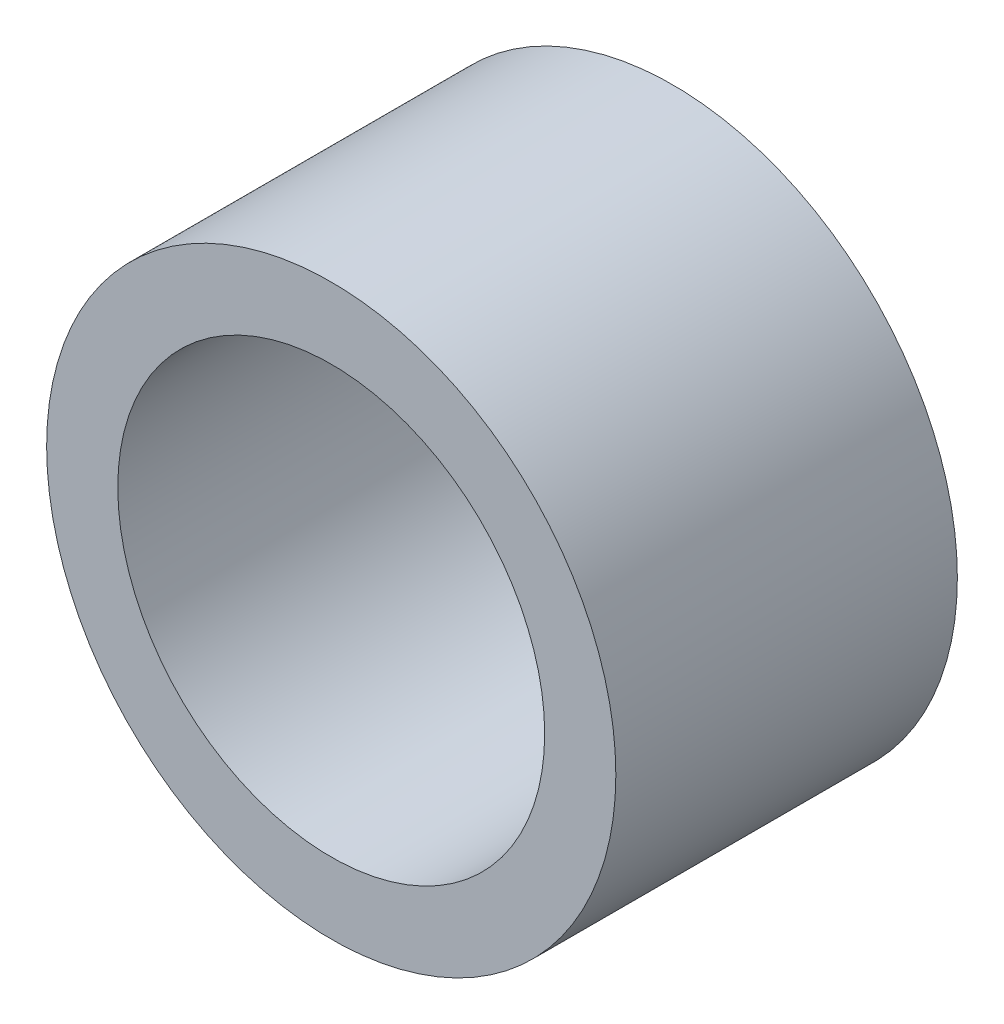
ISO-10303-21;
HEADER;
FILE_DESCRIPTION(('STEP AP214'),'2;1');
FILE_NAME('part.step','',(''),(''),'','','');
FILE_SCHEMA(('AUTOMOTIVE_DESIGN { 1 0 10303 214 1 1 1 1 }'));
ENDSEC;
DATA;
#1=APPLICATION_CONTEXT('core data for automotive mechanical design processes');
#2=APPLICATION_PROTOCOL_DEFINITION('international standard','automotive_design',2000,#1);
#3=PRODUCT_CONTEXT('',#1,'mechanical');
#4=PRODUCT('Part','Part','',(#3));
#5=PRODUCT_RELATED_PRODUCT_CATEGORY('part','',(#4));
#6=PRODUCT_DEFINITION_FORMATION('','',#4);
#7=PRODUCT_DEFINITION_CONTEXT('part definition',#1,'design');
#8=PRODUCT_DEFINITION('design','',#6,#7);
#9=PRODUCT_DEFINITION_SHAPE('','',#8);
#10=(LENGTH_UNIT() NAMED_UNIT(*) SI_UNIT(.MILLI.,.METRE.));
#11=(NAMED_UNIT(*) PLANE_ANGLE_UNIT() SI_UNIT($,.RADIAN.));
#12=(NAMED_UNIT(*) SI_UNIT($,.STERADIAN.) SOLID_ANGLE_UNIT());
#13=UNCERTAINTY_MEASURE_WITH_UNIT(LENGTH_MEASURE(1.E-05),#10,'distance_accuracy_value','');
#14=(GEOMETRIC_REPRESENTATION_CONTEXT(3) GLOBAL_UNCERTAINTY_ASSIGNED_CONTEXT((#13)) GLOBAL_UNIT_ASSIGNED_CONTEXT((#10,
#11,#12)) REPRESENTATION_CONTEXT('',''));
#15=CARTESIAN_POINT('',(0.,0.,0.));
#16=DIRECTION('',(0.,0.,1.));
#17=DIRECTION('',(1.,0.,0.));
#18=AXIS2_PLACEMENT_3D('',#15,#16,#17);
#19=CARTESIAN_POINT('',(0.,0.,12.));
#20=DIRECTION('',(0.,0.,1.));
#21=DIRECTION('',(1.,0.,0.));
#22=AXIS2_PLACEMENT_3D('',#19,#20,#21);
#23=PLANE('',#22);
#24=CARTESIAN_POINT('',(0.,0.,12.));
#25=DIRECTION('',(0.,0.,1.));
#26=DIRECTION('',(1.,0.,0.));
#27=AXIS2_PLACEMENT_3D('',#24,#25,#26);
#28=CIRCLE('',#27,10.);
#29=CARTESIAN_POINT('',(10.,0.,12.));
#30=VERTEX_POINT('',#29);
#31=EDGE_CURVE('E10',#30,#30,#28,.T.);
#32=ORIENTED_EDGE('',*,*,#31,.T.);
#33=EDGE_LOOP('',(#32));
#34=FACE_BOUND('',#33,.T.);
#35=CARTESIAN_POINT('',(0.,0.,12.));
#36=DIRECTION('',(0.,0.,1.));
#37=DIRECTION('',(1.,0.,0.));
#38=AXIS2_PLACEMENT_3D('',#35,#36,#37);
#39=CIRCLE('',#38,7.5);
#40=CARTESIAN_POINT('',(7.5,0.,12.));
#41=VERTEX_POINT('',#40);
#42=EDGE_CURVE('E50',#41,#41,#39,.T.);
#43=ORIENTED_EDGE('',*,*,#42,.F.);
#44=EDGE_LOOP('',(#43));
#45=FACE_BOUND('',#44,.T.);
#46=ADVANCED_FACE('F37',(#34,#45),#23,.T.);
#47=CARTESIAN_POINT('',(0.,0.,0.));
#48=DIRECTION('',(0.,0.,1.));
#49=DIRECTION('',(1.,0.,0.));
#50=AXIS2_PLACEMENT_3D('',#47,#48,#49);
#51=PLANE('',#50);
#52=CARTESIAN_POINT('',(0.,0.,0.));
#53=DIRECTION('',(0.,0.,1.));
#54=DIRECTION('',(1.,0.,0.));
#55=AXIS2_PLACEMENT_3D('',#52,#53,#54);
#56=CIRCLE('',#55,10.);
#57=CARTESIAN_POINT('',(10.,0.,0.));
#58=VERTEX_POINT('',#57);
#59=EDGE_CURVE('E41',#58,#58,#56,.T.);
#60=ORIENTED_EDGE('',*,*,#59,.F.);
#61=EDGE_LOOP('',(#60));
#62=FACE_BOUND('',#61,.T.);
#63=CARTESIAN_POINT('',(0.,0.,0.));
#64=DIRECTION('',(0.,0.,1.));
#65=DIRECTION('',(1.,0.,0.));
#66=AXIS2_PLACEMENT_3D('',#63,#64,#65);
#67=CIRCLE('',#66,7.5);
#68=CARTESIAN_POINT('',(7.5,0.,0.));
#69=VERTEX_POINT('',#68);
#70=EDGE_CURVE('E52',#69,#69,#67,.T.);
#71=ORIENTED_EDGE('',*,*,#70,.T.);
#72=EDGE_LOOP('',(#71));
#73=FACE_BOUND('',#72,.T.);
#74=ADVANCED_FACE('F64',(#62,#73),#51,.F.);
#75=CARTESIAN_POINT('',(0.,0.,12.));
#76=DIRECTION('',(0.,0.,-1.));
#77=DIRECTION('',(-1.,0.,0.));
#78=AXIS2_PLACEMENT_3D('',#75,#76,#77);
#79=CYLINDRICAL_SURFACE('',#78,10.);
#80=ORIENTED_EDGE('',*,*,#31,.F.);
#81=EDGE_LOOP('',(#80));
#82=FACE_BOUND('',#81,.T.);
#83=ORIENTED_EDGE('',*,*,#59,.T.);
#84=EDGE_LOOP('',(#83));
#85=FACE_BOUND('',#84,.T.);
#86=ADVANCED_FACE('F39',(#82,#85),#79,.T.);
#87=CARTESIAN_POINT('',(0.,0.,12.));
#88=DIRECTION('',(0.,0.,-1.));
#89=DIRECTION('',(-1.,0.,0.));
#90=AXIS2_PLACEMENT_3D('',#87,#88,#89);
#91=CYLINDRICAL_SURFACE('',#90,7.5);
#92=ORIENTED_EDGE('',*,*,#42,.T.);
#93=EDGE_LOOP('',(#92));
#94=FACE_BOUND('',#93,.T.);
#95=ORIENTED_EDGE('',*,*,#70,.F.);
#96=EDGE_LOOP('',(#95));
#97=FACE_BOUND('',#96,.T.);
#98=ADVANCED_FACE('F60',(#94,#97),#91,.F.);
#99=CLOSED_SHELL('',(#46,#74,#86,#98));
#100=MANIFOLD_SOLID_BREP('B2',#99);
#101=ADVANCED_BREP_SHAPE_REPRESENTATION('',(#18,#100),#14);
#102=SHAPE_DEFINITION_REPRESENTATION(#9,#101);
ENDSEC;
END-ISO-10303-21;
